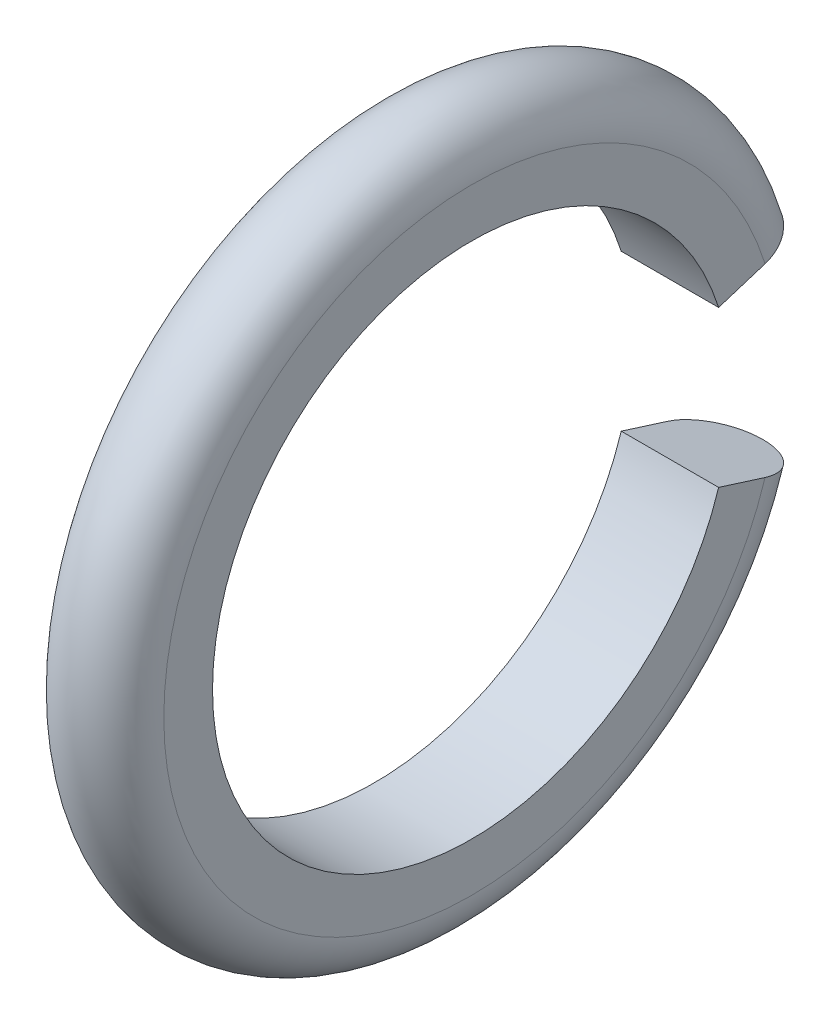
ISO-10303-21;
HEADER;
FILE_DESCRIPTION(('STEP AP214'),'2;1');
FILE_NAME('part.step','',(''),(''),'','','');
FILE_SCHEMA(('AUTOMOTIVE_DESIGN { 1 0 10303 214 1 1 1 1 }'));
ENDSEC;
DATA;
#1=APPLICATION_CONTEXT('core data for automotive mechanical design processes');
#2=APPLICATION_PROTOCOL_DEFINITION('international standard','automotive_design',2000,#1);
#3=PRODUCT_CONTEXT('',#1,'mechanical');
#4=PRODUCT('Part','Part','',(#3));
#5=PRODUCT_RELATED_PRODUCT_CATEGORY('part','',(#4));
#6=PRODUCT_DEFINITION_FORMATION('','',#4);
#7=PRODUCT_DEFINITION_CONTEXT('part definition',#1,'design');
#8=PRODUCT_DEFINITION('design','',#6,#7);
#9=PRODUCT_DEFINITION_SHAPE('','',#8);
#10=(LENGTH_UNIT() NAMED_UNIT(*) SI_UNIT(.MILLI.,.METRE.));
#11=(NAMED_UNIT(*) PLANE_ANGLE_UNIT() SI_UNIT($,.RADIAN.));
#12=(NAMED_UNIT(*) SI_UNIT($,.STERADIAN.) SOLID_ANGLE_UNIT());
#13=UNCERTAINTY_MEASURE_WITH_UNIT(LENGTH_MEASURE(1.E-05),#10,'distance_accuracy_value','');
#14=(GEOMETRIC_REPRESENTATION_CONTEXT(3) GLOBAL_UNCERTAINTY_ASSIGNED_CONTEXT((#13)) GLOBAL_UNIT_ASSIGNED_CONTEXT((#10,
#11,#12)) REPRESENTATION_CONTEXT('',''));
#15=CARTESIAN_POINT('',(0.,0.,0.));
#16=DIRECTION('',(0.,0.,1.));
#17=DIRECTION('',(1.,0.,0.));
#18=AXIS2_PLACEMENT_3D('',#15,#16,#17);
#19=CARTESIAN_POINT('',(0.,0.,0.));
#20=DIRECTION('',(-1.,0.,0.));
#21=DIRECTION('',(0.,0.,1.));
#22=AXIS2_PLACEMENT_3D('',#19,#20,#21);
#23=TOROIDAL_SURFACE('',#22,10.033,1.5875);
#24=CARTESIAN_POINT('',(-1.5875,0.,0.));
#25=DIRECTION('',(-1.,0.,0.));
#26=DIRECTION('',(0.,0.,1.));
#27=AXIS2_PLACEMENT_3D('',#24,#25,#26);
#28=CIRCLE('',#27,10.033);
#29=CARTESIAN_POINT('',(-1.5875,-3.01698128642638,-9.56864216685696));
#30=VERTEX_POINT('',#29);
#31=CARTESIAN_POINT('',(-1.5875,3.01698128642631,-9.56864216685698));
#32=VERTEX_POINT('',#31);
#33=EDGE_CURVE('E89',#30,#32,#28,.T.);
#34=ORIENTED_EDGE('',*,*,#33,.F.);
#35=CARTESIAN_POINT('',(0.,-3.01698128642638,-9.56864216685696));
#36=DIRECTION('',(0.,-0.953716950748227,0.300705799504274));
#37=DIRECTION('',(0.,-0.300705799504274,-0.953716950748227));
#38=AXIS2_PLACEMENT_3D('',#35,#36,#37);
#39=CIRCLE('',#38,1.5875);
#40=CARTESIAN_POINT('',(1.5875,-3.01698128642638,-9.56864216685696));
#41=VERTEX_POINT('',#40);
#42=EDGE_CURVE('E107',#30,#41,#39,.T.);
#43=ORIENTED_EDGE('',*,*,#42,.T.);
#44=CARTESIAN_POINT('',(1.5875,0.,0.));
#45=DIRECTION('',(-1.,0.,0.));
#46=DIRECTION('',(0.,0.,1.));
#47=AXIS2_PLACEMENT_3D('',#44,#45,#46);
#48=CIRCLE('',#47,10.033);
#49=CARTESIAN_POINT('',(1.5875,3.01698128642631,-9.56864216685698));
#50=VERTEX_POINT('',#49);
#51=EDGE_CURVE('E102',#41,#50,#48,.T.);
#52=ORIENTED_EDGE('',*,*,#51,.T.);
#53=CARTESIAN_POINT('',(0.,3.01698128642631,-9.56864216685698));
#54=DIRECTION('',(0.,0.953716950748229,0.300705799504267));
#55=DIRECTION('',(0.,-0.300705799504267,0.953716950748229));
#56=AXIS2_PLACEMENT_3D('',#53,#54,#55);
#57=CIRCLE('',#56,1.5875);
#58=EDGE_CURVE('E65',#50,#32,#57,.T.);
#59=ORIENTED_EDGE('',*,*,#58,.T.);
#60=EDGE_LOOP('',(#34,#43,#52,#59));
#61=FACE_BOUND('',#60,.T.);
#62=ADVANCED_FACE('F43',(#61),#23,.T.);
#63=CARTESIAN_POINT('',(-1.5875,8.4455,0.));
#64=DIRECTION('',(1.,0.,0.));
#65=DIRECTION('',(0.,0.,-1.));
#66=AXIS2_PLACEMENT_3D('',#63,#64,#65);
#67=PLANE('',#66);
#68=CARTESIAN_POINT('',(-1.5875,0.,0.));
#69=DIRECTION('',(-1.,0.,0.));
#70=DIRECTION('',(0.,0.,1.));
#71=AXIS2_PLACEMENT_3D('',#68,#69,#70);
#72=CIRCLE('',#71,8.4455);
#73=CARTESIAN_POINT('',(-1.5875,-2.53961082971335,-8.05461650754415));
#74=VERTEX_POINT('',#73);
#75=CARTESIAN_POINT('',(-1.5875,2.53961082971329,-8.05461650754417));
#76=VERTEX_POINT('',#75);
#77=EDGE_CURVE('E96',#74,#76,#72,.T.);
#78=ORIENTED_EDGE('',*,*,#77,.F.);
#79=DIRECTION('',(0.,-0.300705799504274,-0.953716950748227));
#80=VECTOR('',#79,1.);
#81=CARTESIAN_POINT('',(-1.5875,-4.79318430368914,-15.2020384243494));
#82=LINE('',#81,#80);
#83=EDGE_CURVE('E117',#74,#30,#82,.T.);
#84=ORIENTED_EDGE('',*,*,#83,.T.);
#85=ORIENTED_EDGE('',*,*,#33,.T.);
#86=DIRECTION('',(0.,-0.300705799504267,0.953716950748229));
#87=VECTOR('',#86,1.);
#88=CARTESIAN_POINT('',(-1.5875,0.,0.));
#89=LINE('',#88,#87);
#90=EDGE_CURVE('E98',#32,#76,#89,.T.);
#91=ORIENTED_EDGE('',*,*,#90,.T.);
#92=EDGE_LOOP('',(#78,#84,#85,#91));
#93=FACE_BOUND('',#92,.T.);
#94=ADVANCED_FACE('F116',(#93),#67,.F.);
#95=CARTESIAN_POINT('',(-5.00914014951616,0.,0.));
#96=DIRECTION('',(-1.,0.,0.));
#97=DIRECTION('',(0.,0.,1.));
#98=AXIS2_PLACEMENT_3D('',#95,#96,#97);
#99=CYLINDRICAL_SURFACE('',#98,8.4455);
#100=CARTESIAN_POINT('',(1.5875,0.,0.));
#101=DIRECTION('',(-1.,0.,0.));
#102=DIRECTION('',(0.,0.,1.));
#103=AXIS2_PLACEMENT_3D('',#100,#101,#102);
#104=CIRCLE('',#103,8.4455);
#105=CARTESIAN_POINT('',(1.5875,-2.53961082971334,-8.05461650754415));
#106=VERTEX_POINT('',#105);
#107=CARTESIAN_POINT('',(1.5875,2.53961082971329,-8.05461650754417));
#108=VERTEX_POINT('',#107);
#109=EDGE_CURVE('E94',#106,#108,#104,.T.);
#110=ORIENTED_EDGE('',*,*,#109,.F.);
#111=DIRECTION('',(-1.,0.,0.));
#112=VECTOR('',#111,1.);
#113=CARTESIAN_POINT('',(-5.00914014951616,-2.53961082971335,-8.05461650754415));
#114=LINE('',#113,#112);
#115=EDGE_CURVE('E58',#106,#74,#114,.T.);
#116=ORIENTED_EDGE('',*,*,#115,.T.);
#117=ORIENTED_EDGE('',*,*,#77,.T.);
#118=DIRECTION('',(-1.,0.,0.));
#119=VECTOR('',#118,1.);
#120=CARTESIAN_POINT('',(-5.00914014951616,2.53961082971329,-8.05461650754417));
#121=LINE('',#120,#119);
#122=EDGE_CURVE('E82',#76,#108,#121,.F.);
#123=ORIENTED_EDGE('',*,*,#122,.T.);
#124=EDGE_LOOP('',(#110,#116,#117,#123));
#125=FACE_BOUND('',#124,.T.);
#126=ADVANCED_FACE('F93',(#125),#99,.F.);
#127=CARTESIAN_POINT('',(1.5875,10.033,0.));
#128=DIRECTION('',(-1.,0.,0.));
#129=DIRECTION('',(0.,0.,1.));
#130=AXIS2_PLACEMENT_3D('',#127,#128,#129);
#131=PLANE('',#130);
#132=ORIENTED_EDGE('',*,*,#51,.F.);
#133=DIRECTION('',(0.,0.300705799504274,0.953716950748227));
#134=VECTOR('',#133,1.);
#135=CARTESIAN_POINT('',(1.5875,0.907223769824276,2.87734619295503));
#136=LINE('',#135,#134);
#137=EDGE_CURVE('E11',#41,#106,#136,.T.);
#138=ORIENTED_EDGE('',*,*,#137,.T.);
#139=ORIENTED_EDGE('',*,*,#109,.T.);
#140=DIRECTION('',(0.,0.300705799504267,-0.953716950748229));
#141=VECTOR('',#140,1.);
#142=CARTESIAN_POINT('',(1.5875,0.907223769824234,-2.87734619295497));
#143=LINE('',#142,#141);
#144=EDGE_CURVE('E51',#108,#50,#143,.T.);
#145=ORIENTED_EDGE('',*,*,#144,.T.);
#146=EDGE_LOOP('',(#132,#138,#139,#145));
#147=FACE_BOUND('',#146,.T.);
#148=ADVANCED_FACE('F100',(#147),#131,.F.);
#149=CARTESIAN_POINT('',(-1.5875,0.,0.));
#150=DIRECTION('',(0.,0.953716950748229,0.300705799504267));
#151=DIRECTION('',(0.,-0.300705799504267,0.953716950748229));
#152=AXIS2_PLACEMENT_3D('',#149,#150,#151);
#153=PLANE('',#152);
#154=ORIENTED_EDGE('',*,*,#144,.F.);
#155=ORIENTED_EDGE('',*,*,#122,.F.);
#156=ORIENTED_EDGE('',*,*,#90,.F.);
#157=ORIENTED_EDGE('',*,*,#58,.F.);
#158=EDGE_LOOP('',(#154,#155,#156,#157));
#159=FACE_BOUND('',#158,.T.);
#160=ADVANCED_FACE('F81',(#159),#153,.F.);
#161=CARTESIAN_POINT('',(-1.5875,-4.79318430368914,-15.2020384243494));
#162=DIRECTION('',(0.,-0.953716950748227,0.300705799504274));
#163=DIRECTION('',(0.,-0.300705799504274,-0.953716950748227));
#164=AXIS2_PLACEMENT_3D('',#161,#162,#163);
#165=PLANE('',#164);
#166=ORIENTED_EDGE('',*,*,#83,.F.);
#167=ORIENTED_EDGE('',*,*,#115,.F.);
#168=ORIENTED_EDGE('',*,*,#137,.F.);
#169=ORIENTED_EDGE('',*,*,#42,.F.);
#170=EDGE_LOOP('',(#166,#167,#168,#169));
#171=FACE_BOUND('',#170,.T.);
#172=ADVANCED_FACE('F129',(#171),#165,.F.);
#173=CLOSED_SHELL('',(#62,#94,#126,#148,#160,#172));
#174=MANIFOLD_SOLID_BREP('B2',#173);
#175=ADVANCED_BREP_SHAPE_REPRESENTATION('',(#18,#174),#14);
#176=SHAPE_DEFINITION_REPRESENTATION(#9,#175);
ENDSEC;
END-ISO-10303-21;
